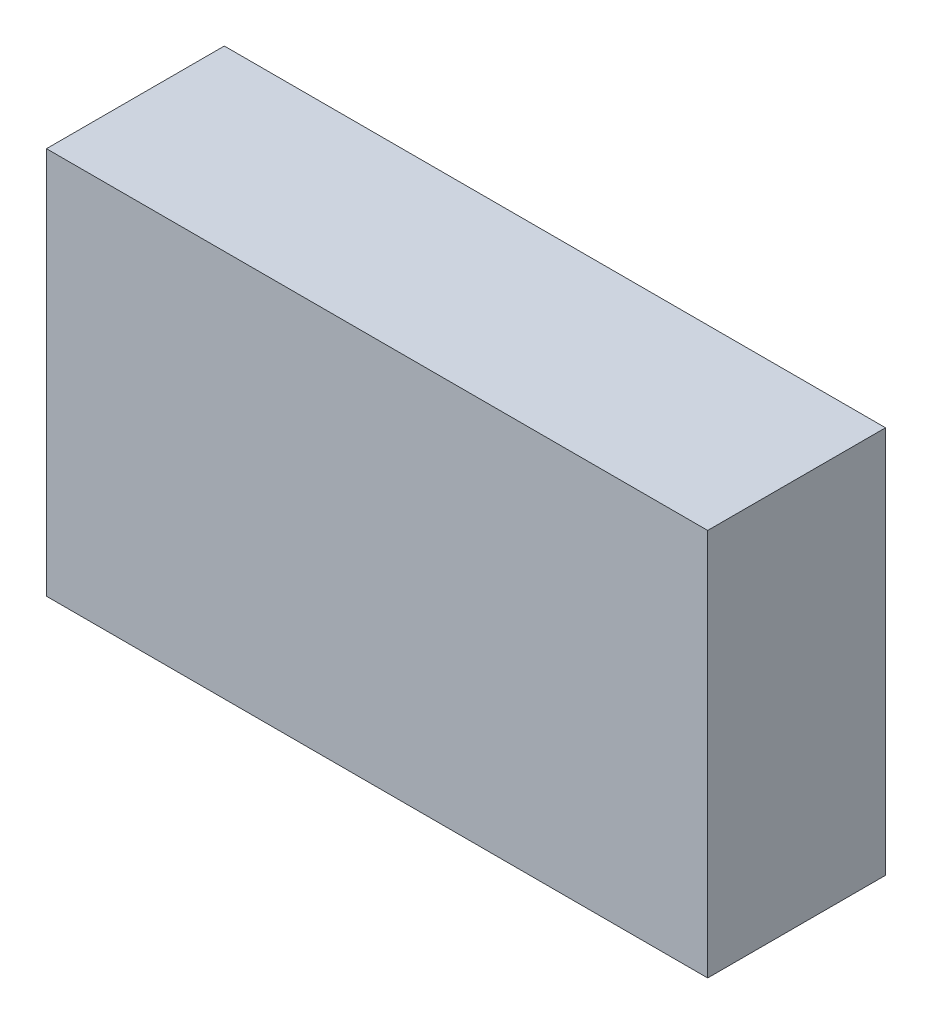
ISO-10303-21;
HEADER;
FILE_DESCRIPTION(('STEP AP214'),'2;1');
FILE_NAME('part.step','',(''),(''),'','','');
FILE_SCHEMA(('AUTOMOTIVE_DESIGN { 1 0 10303 214 1 1 1 1 }'));
ENDSEC;
DATA;
#1=APPLICATION_CONTEXT('core data for automotive mechanical design processes');
#2=APPLICATION_PROTOCOL_DEFINITION('international standard','automotive_design',2000,#1);
#3=PRODUCT_CONTEXT('',#1,'mechanical');
#4=PRODUCT('Part','Part','',(#3));
#5=PRODUCT_RELATED_PRODUCT_CATEGORY('part','',(#4));
#6=PRODUCT_DEFINITION_FORMATION('','',#4);
#7=PRODUCT_DEFINITION_CONTEXT('part definition',#1,'design');
#8=PRODUCT_DEFINITION('design','',#6,#7);
#9=PRODUCT_DEFINITION_SHAPE('','',#8);
#10=(LENGTH_UNIT() NAMED_UNIT(*) SI_UNIT(.MILLI.,.METRE.));
#11=(NAMED_UNIT(*) PLANE_ANGLE_UNIT() SI_UNIT($,.RADIAN.));
#12=(NAMED_UNIT(*) SI_UNIT($,.STERADIAN.) SOLID_ANGLE_UNIT());
#13=UNCERTAINTY_MEASURE_WITH_UNIT(LENGTH_MEASURE(1.E-05),#10,'distance_accuracy_value','');
#14=(GEOMETRIC_REPRESENTATION_CONTEXT(3) GLOBAL_UNCERTAINTY_ASSIGNED_CONTEXT((#13)) GLOBAL_UNIT_ASSIGNED_CONTEXT((#10,
#11,#12)) REPRESENTATION_CONTEXT('',''));
#15=CARTESIAN_POINT('',(0.,0.,0.));
#16=DIRECTION('',(0.,0.,1.));
#17=DIRECTION('',(1.,0.,0.));
#18=AXIS2_PLACEMENT_3D('',#15,#16,#17);
#19=CARTESIAN_POINT('',(29.,-17.,15.6));
#20=DIRECTION('',(-1.,0.,0.));
#21=DIRECTION('',(0.,0.,1.));
#22=AXIS2_PLACEMENT_3D('',#19,#20,#21);
#23=PLANE('',#22);
#24=DIRECTION('',(0.,1.,0.));
#25=VECTOR('',#24,1.);
#26=CARTESIAN_POINT('',(29.,-17.,0.));
#27=LINE('',#26,#25);
#28=CARTESIAN_POINT('',(29.,-17.,0.));
#29=VERTEX_POINT('',#28);
#30=CARTESIAN_POINT('',(29.,17.,0.));
#31=VERTEX_POINT('',#30);
#32=EDGE_CURVE('E102',#29,#31,#27,.T.);
#33=ORIENTED_EDGE('',*,*,#32,.T.);
#34=DIRECTION('',(0.,0.,-1.));
#35=VECTOR('',#34,1.);
#36=CARTESIAN_POINT('',(29.,17.,15.6));
#37=LINE('',#36,#35);
#38=CARTESIAN_POINT('',(29.,17.,15.6));
#39=VERTEX_POINT('',#38);
#40=EDGE_CURVE('E11',#39,#31,#37,.T.);
#41=ORIENTED_EDGE('',*,*,#40,.F.);
#42=DIRECTION('',(0.,1.,0.));
#43=VECTOR('',#42,1.);
#44=CARTESIAN_POINT('',(29.,-17.,15.6));
#45=LINE('',#44,#43);
#46=CARTESIAN_POINT('',(29.,-17.,15.6));
#47=VERTEX_POINT('',#46);
#48=EDGE_CURVE('E90',#47,#39,#45,.T.);
#49=ORIENTED_EDGE('',*,*,#48,.F.);
#50=DIRECTION('',(0.,0.,-1.));
#51=VECTOR('',#50,1.);
#52=CARTESIAN_POINT('',(29.,-17.,15.6));
#53=LINE('',#52,#51);
#54=EDGE_CURVE('E98',#47,#29,#53,.T.);
#55=ORIENTED_EDGE('',*,*,#54,.T.);
#56=EDGE_LOOP('',(#33,#41,#49,#55));
#57=FACE_BOUND('',#56,.T.);
#58=ADVANCED_FACE('F39',(#57),#23,.F.);
#59=CARTESIAN_POINT('',(-29.,17.,15.6));
#60=DIRECTION('',(0.,-1.,0.));
#61=DIRECTION('',(0.,0.,-1.));
#62=AXIS2_PLACEMENT_3D('',#59,#60,#61);
#63=PLANE('',#62);
#64=DIRECTION('',(-1.,0.,0.));
#65=VECTOR('',#64,1.);
#66=CARTESIAN_POINT('',(-29.,17.,0.));
#67=LINE('',#66,#65);
#68=CARTESIAN_POINT('',(-29.,17.,0.));
#69=VERTEX_POINT('',#68);
#70=EDGE_CURVE('E94',#31,#69,#67,.T.);
#71=ORIENTED_EDGE('',*,*,#70,.T.);
#72=DIRECTION('',(0.,0.,-1.));
#73=VECTOR('',#72,1.);
#74=CARTESIAN_POINT('',(-29.,17.,15.6));
#75=LINE('',#74,#73);
#76=CARTESIAN_POINT('',(-29.,17.,15.6));
#77=VERTEX_POINT('',#76);
#78=EDGE_CURVE('E47',#77,#69,#75,.T.);
#79=ORIENTED_EDGE('',*,*,#78,.F.);
#80=DIRECTION('',(-1.,0.,0.));
#81=VECTOR('',#80,1.);
#82=CARTESIAN_POINT('',(-29.,17.,15.6));
#83=LINE('',#82,#81);
#84=EDGE_CURVE('E85',#39,#77,#83,.T.);
#85=ORIENTED_EDGE('',*,*,#84,.F.);
#86=ORIENTED_EDGE('',*,*,#40,.T.);
#87=EDGE_LOOP('',(#71,#79,#85,#86));
#88=FACE_BOUND('',#87,.T.);
#89=ADVANCED_FACE('F93',(#88),#63,.F.);
#90=CARTESIAN_POINT('',(-29.,-17.,15.6));
#91=DIRECTION('',(1.,0.,0.));
#92=DIRECTION('',(0.,0.,-1.));
#93=AXIS2_PLACEMENT_3D('',#90,#91,#92);
#94=PLANE('',#93);
#95=DIRECTION('',(0.,-1.,0.));
#96=VECTOR('',#95,1.);
#97=CARTESIAN_POINT('',(-29.,-17.,0.));
#98=LINE('',#97,#96);
#99=CARTESIAN_POINT('',(-29.,-17.,0.));
#100=VERTEX_POINT('',#99);
#101=EDGE_CURVE('E72',#69,#100,#98,.T.);
#102=ORIENTED_EDGE('',*,*,#101,.T.);
#103=DIRECTION('',(0.,0.,-1.));
#104=VECTOR('',#103,1.);
#105=CARTESIAN_POINT('',(-29.,-17.,15.6));
#106=LINE('',#105,#104);
#107=CARTESIAN_POINT('',(-29.,-17.,15.6));
#108=VERTEX_POINT('',#107);
#109=EDGE_CURVE('E95',#108,#100,#106,.T.);
#110=ORIENTED_EDGE('',*,*,#109,.F.);
#111=DIRECTION('',(0.,-1.,0.));
#112=VECTOR('',#111,1.);
#113=CARTESIAN_POINT('',(-29.,-17.,15.6));
#114=LINE('',#113,#112);
#115=EDGE_CURVE('E88',#77,#108,#114,.T.);
#116=ORIENTED_EDGE('',*,*,#115,.F.);
#117=ORIENTED_EDGE('',*,*,#78,.T.);
#118=EDGE_LOOP('',(#102,#110,#116,#117));
#119=FACE_BOUND('',#118,.T.);
#120=ADVANCED_FACE('F96',(#119),#94,.F.);
#121=CARTESIAN_POINT('',(-29.,-17.,15.6));
#122=DIRECTION('',(0.,1.,0.));
#123=DIRECTION('',(0.,0.,1.));
#124=AXIS2_PLACEMENT_3D('',#121,#122,#123);
#125=PLANE('',#124);
#126=DIRECTION('',(1.,0.,0.));
#127=VECTOR('',#126,1.);
#128=CARTESIAN_POINT('',(-29.,-17.,0.));
#129=LINE('',#128,#127);
#130=EDGE_CURVE('E78',#100,#29,#129,.T.);
#131=ORIENTED_EDGE('',*,*,#130,.T.);
#132=ORIENTED_EDGE('',*,*,#54,.F.);
#133=DIRECTION('',(1.,0.,0.));
#134=VECTOR('',#133,1.);
#135=CARTESIAN_POINT('',(-29.,-17.,15.6));
#136=LINE('',#135,#134);
#137=EDGE_CURVE('E55',#108,#47,#136,.T.);
#138=ORIENTED_EDGE('',*,*,#137,.F.);
#139=ORIENTED_EDGE('',*,*,#109,.T.);
#140=EDGE_LOOP('',(#131,#132,#138,#139));
#141=FACE_BOUND('',#140,.T.);
#142=ADVANCED_FACE('F109',(#141),#125,.F.);
#143=CARTESIAN_POINT('',(0.,0.,15.6));
#144=DIRECTION('',(0.,0.,-1.));
#145=DIRECTION('',(-1.,0.,0.));
#146=AXIS2_PLACEMENT_3D('',#143,#144,#145);
#147=PLANE('',#146);
#148=ORIENTED_EDGE('',*,*,#48,.T.);
#149=ORIENTED_EDGE('',*,*,#84,.T.);
#150=ORIENTED_EDGE('',*,*,#115,.T.);
#151=ORIENTED_EDGE('',*,*,#137,.T.);
#152=EDGE_LOOP('',(#148,#149,#150,#151));
#153=FACE_BOUND('',#152,.T.);
#154=ADVANCED_FACE('F86',(#153),#147,.F.);
#155=CARTESIAN_POINT('',(0.,0.,0.));
#156=DIRECTION('',(0.,0.,-1.));
#157=DIRECTION('',(-1.,0.,0.));
#158=AXIS2_PLACEMENT_3D('',#155,#156,#157);
#159=PLANE('',#158);
#160=ORIENTED_EDGE('',*,*,#32,.F.);
#161=ORIENTED_EDGE('',*,*,#130,.F.);
#162=ORIENTED_EDGE('',*,*,#101,.F.);
#163=ORIENTED_EDGE('',*,*,#70,.F.);
#164=EDGE_LOOP('',(#160,#161,#162,#163));
#165=FACE_BOUND('',#164,.T.);
#166=ADVANCED_FACE('F112',(#165),#159,.T.);
#167=CLOSED_SHELL('',(#58,#89,#120,#142,#154,#166));
#168=MANIFOLD_SOLID_BREP('B2',#167);
#169=ADVANCED_BREP_SHAPE_REPRESENTATION('',(#18,#168),#14);
#170=SHAPE_DEFINITION_REPRESENTATION(#9,#169);
ENDSEC;
END-ISO-10303-21;
